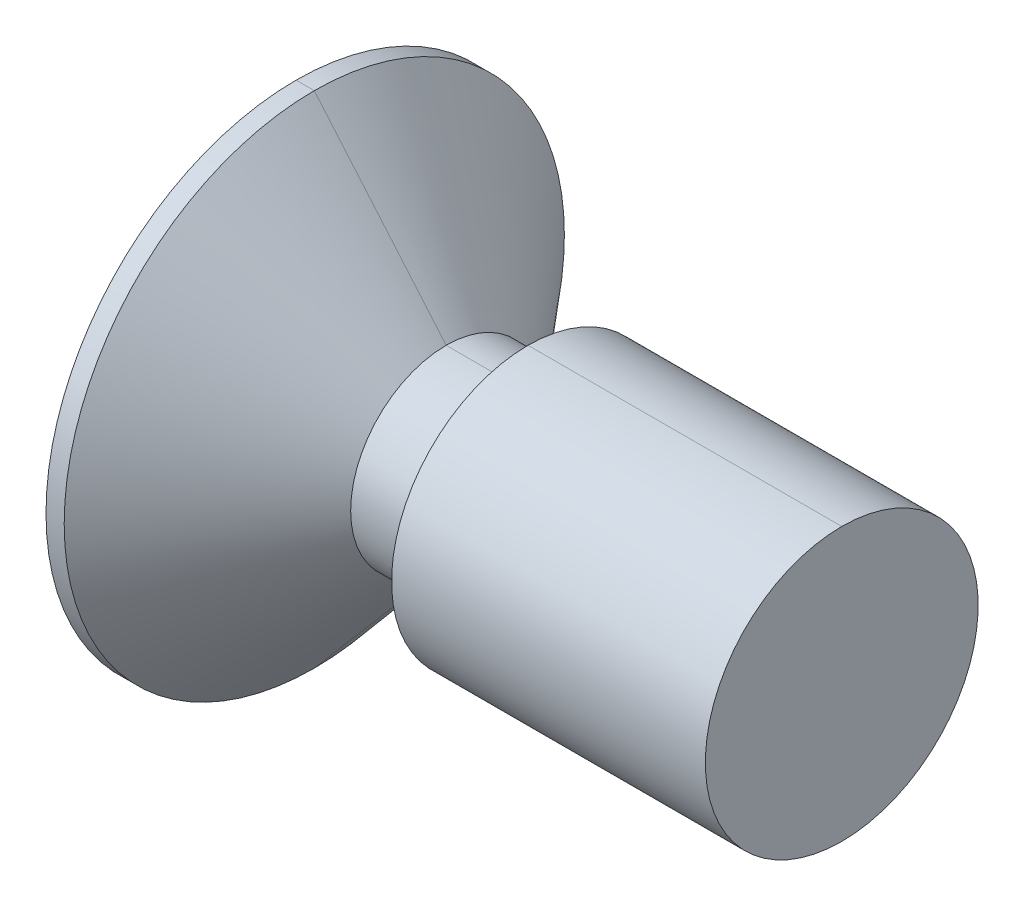
ISO-10303-21;
HEADER;
FILE_DESCRIPTION(('STEP AP214'),'2;1');
FILE_NAME('part.step','',(''),(''),'','','');
FILE_SCHEMA(('AUTOMOTIVE_DESIGN { 1 0 10303 214 1 1 1 1 }'));
ENDSEC;
DATA;
#1=APPLICATION_CONTEXT('core data for automotive mechanical design processes');
#2=APPLICATION_PROTOCOL_DEFINITION('international standard','automotive_design',2000,#1);
#3=PRODUCT_CONTEXT('',#1,'mechanical');
#4=PRODUCT('Part','Part','',(#3));
#5=PRODUCT_RELATED_PRODUCT_CATEGORY('part','',(#4));
#6=PRODUCT_DEFINITION_FORMATION('','',#4);
#7=PRODUCT_DEFINITION_CONTEXT('part definition',#1,'design');
#8=PRODUCT_DEFINITION('design','',#6,#7);
#9=PRODUCT_DEFINITION_SHAPE('','',#8);
#10=(LENGTH_UNIT() NAMED_UNIT(*) SI_UNIT(.MILLI.,.METRE.));
#11=(NAMED_UNIT(*) PLANE_ANGLE_UNIT() SI_UNIT($,.RADIAN.));
#12=(NAMED_UNIT(*) SI_UNIT($,.STERADIAN.) SOLID_ANGLE_UNIT());
#13=UNCERTAINTY_MEASURE_WITH_UNIT(LENGTH_MEASURE(1.E-05),#10,'distance_accuracy_value','');
#14=(GEOMETRIC_REPRESENTATION_CONTEXT(3) GLOBAL_UNCERTAINTY_ASSIGNED_CONTEXT((#13)) GLOBAL_UNIT_ASSIGNED_CONTEXT((#10,
#11,#12)) REPRESENTATION_CONTEXT('',''));
#15=CARTESIAN_POINT('',(0.,0.,0.));
#16=DIRECTION('',(0.,0.,1.));
#17=DIRECTION('',(1.,0.,0.));
#18=AXIS2_PLACEMENT_3D('',#15,#16,#17);
#19=CARTESIAN_POINT('',(-5.175,0.675,-0.675));
#20=DIRECTION('',(1.,0.,0.));
#21=DIRECTION('',(0.,1.,0.));
#22=AXIS2_PLACEMENT_3D('',#19,#20,#21);
#23=PLANE('',#22);
#24=DIRECTION('',(0.,-1.,0.));
#25=VECTOR('',#24,1.);
#26=CARTESIAN_POINT('',(-5.175,1.8,-0.375));
#27=LINE('',#26,#25);
#28=CARTESIAN_POINT('',(-5.175,1.8,-0.375));
#29=VERTEX_POINT('',#28);
#30=CARTESIAN_POINT('',(-5.175,0.675,-0.375));
#31=VERTEX_POINT('',#30);
#32=EDGE_CURVE('E346',#29,#31,#27,.T.);
#33=ORIENTED_EDGE('',*,*,#32,.T.);
#34=CARTESIAN_POINT('',(-5.175,0.675,-0.675));
#35=DIRECTION('',(1.,0.,0.));
#36=DIRECTION('',(0.,1.,0.));
#37=AXIS2_PLACEMENT_3D('',#34,#35,#36);
#38=CIRCLE('',#37,0.3);
#39=CARTESIAN_POINT('',(-5.175,0.375,-0.675));
#40=VERTEX_POINT('',#39);
#41=EDGE_CURVE('E10',#31,#40,#38,.T.);
#42=ORIENTED_EDGE('',*,*,#41,.T.);
#43=DIRECTION('',(0.,0.,-1.));
#44=VECTOR('',#43,1.);
#45=CARTESIAN_POINT('',(-5.175,0.375,-1.8));
#46=LINE('',#45,#44);
#47=CARTESIAN_POINT('',(-5.175,0.375,-1.8));
#48=VERTEX_POINT('',#47);
#49=EDGE_CURVE('E271',#40,#48,#46,.T.);
#50=ORIENTED_EDGE('',*,*,#49,.T.);
#51=DIRECTION('',(0.,-1.,0.));
#52=VECTOR('',#51,1.);
#53=CARTESIAN_POINT('',(-5.175,0.375,-1.8));
#54=LINE('',#53,#52);
#55=CARTESIAN_POINT('',(-5.175,-0.375,-1.8));
#56=VERTEX_POINT('',#55);
#57=EDGE_CURVE('E386',#48,#56,#54,.T.);
#58=ORIENTED_EDGE('',*,*,#57,.T.);
#59=DIRECTION('',(0.,0.,1.));
#60=VECTOR('',#59,1.);
#61=CARTESIAN_POINT('',(-5.175,-0.375,-1.8));
#62=LINE('',#61,#60);
#63=CARTESIAN_POINT('',(-5.175,-0.375,-0.675));
#64=VERTEX_POINT('',#63);
#65=EDGE_CURVE('E377',#56,#64,#62,.T.);
#66=ORIENTED_EDGE('',*,*,#65,.T.);
#67=CARTESIAN_POINT('',(-5.175,-0.675,-0.675));
#68=DIRECTION('',(1.,0.,0.));
#69=DIRECTION('',(0.,-1.,0.));
#70=AXIS2_PLACEMENT_3D('',#67,#68,#69);
#71=CIRCLE('',#70,0.3);
#72=CARTESIAN_POINT('',(-5.175,-0.675,-0.375));
#73=VERTEX_POINT('',#72);
#74=EDGE_CURVE('E281',#64,#73,#71,.T.);
#75=ORIENTED_EDGE('',*,*,#74,.T.);
#76=DIRECTION('',(0.,-1.,0.));
#77=VECTOR('',#76,1.);
#78=CARTESIAN_POINT('',(-5.175,-0.675,-0.375));
#79=LINE('',#78,#77);
#80=CARTESIAN_POINT('',(-5.175,-1.8,-0.375));
#81=VERTEX_POINT('',#80);
#82=EDGE_CURVE('E275',#73,#81,#79,.T.);
#83=ORIENTED_EDGE('',*,*,#82,.T.);
#84=DIRECTION('',(0.,0.,1.));
#85=VECTOR('',#84,1.);
#86=CARTESIAN_POINT('',(-5.175,-1.8,-0.375));
#87=LINE('',#86,#85);
#88=CARTESIAN_POINT('',(-5.175,-1.8,0.375));
#89=VERTEX_POINT('',#88);
#90=EDGE_CURVE('E268',#81,#89,#87,.T.);
#91=ORIENTED_EDGE('',*,*,#90,.T.);
#92=DIRECTION('',(0.,1.,0.));
#93=VECTOR('',#92,1.);
#94=CARTESIAN_POINT('',(-5.175,-0.675,0.375));
#95=LINE('',#94,#93);
#96=CARTESIAN_POINT('',(-5.175,-0.675,0.375));
#97=VERTEX_POINT('',#96);
#98=EDGE_CURVE('E223',#89,#97,#95,.T.);
#99=ORIENTED_EDGE('',*,*,#98,.T.);
#100=CARTESIAN_POINT('',(-5.175,-0.675,0.675));
#101=DIRECTION('',(1.,0.,0.));
#102=DIRECTION('',(0.,1.,0.));
#103=AXIS2_PLACEMENT_3D('',#100,#101,#102);
#104=CIRCLE('',#103,0.3);
#105=CARTESIAN_POINT('',(-5.175,-0.375,0.675));
#106=VERTEX_POINT('',#105);
#107=EDGE_CURVE('E221',#97,#106,#104,.T.);
#108=ORIENTED_EDGE('',*,*,#107,.T.);
#109=DIRECTION('',(0.,0.,1.));
#110=VECTOR('',#109,1.);
#111=CARTESIAN_POINT('',(-5.175,-0.375,0.675));
#112=LINE('',#111,#110);
#113=CARTESIAN_POINT('',(-5.175,-0.375,1.8));
#114=VERTEX_POINT('',#113);
#115=EDGE_CURVE('E276',#106,#114,#112,.T.);
#116=ORIENTED_EDGE('',*,*,#115,.T.);
#117=DIRECTION('',(0.,1.,0.));
#118=VECTOR('',#117,1.);
#119=CARTESIAN_POINT('',(-5.175,0.375,1.8));
#120=LINE('',#119,#118);
#121=CARTESIAN_POINT('',(-5.175,0.375,1.8));
#122=VERTEX_POINT('',#121);
#123=EDGE_CURVE('E264',#114,#122,#120,.T.);
#124=ORIENTED_EDGE('',*,*,#123,.T.);
#125=DIRECTION('',(0.,0.,-1.));
#126=VECTOR('',#125,1.);
#127=CARTESIAN_POINT('',(-5.175,0.375,0.675));
#128=LINE('',#127,#126);
#129=CARTESIAN_POINT('',(-5.175,0.375,0.675));
#130=VERTEX_POINT('',#129);
#131=EDGE_CURVE('E265',#122,#130,#128,.T.);
#132=ORIENTED_EDGE('',*,*,#131,.T.);
#133=CARTESIAN_POINT('',(-5.175,0.675,0.675));
#134=DIRECTION('',(1.,0.,0.));
#135=DIRECTION('',(0.,1.,0.));
#136=AXIS2_PLACEMENT_3D('',#133,#134,#135);
#137=CIRCLE('',#136,0.3);
#138=CARTESIAN_POINT('',(-5.175,0.675,0.375));
#139=VERTEX_POINT('',#138);
#140=EDGE_CURVE('E254',#130,#139,#137,.T.);
#141=ORIENTED_EDGE('',*,*,#140,.T.);
#142=DIRECTION('',(0.,1.,0.));
#143=VECTOR('',#142,1.);
#144=CARTESIAN_POINT('',(-5.175,1.8,0.375));
#145=LINE('',#144,#143);
#146=CARTESIAN_POINT('',(-5.175,1.8,0.375));
#147=VERTEX_POINT('',#146);
#148=EDGE_CURVE('E255',#139,#147,#145,.T.);
#149=ORIENTED_EDGE('',*,*,#148,.T.);
#150=DIRECTION('',(0.,0.,-1.));
#151=VECTOR('',#150,1.);
#152=CARTESIAN_POINT('',(-5.175,1.8,-0.375));
#153=LINE('',#152,#151);
#154=EDGE_CURVE('E345',#147,#29,#153,.T.);
#155=ORIENTED_EDGE('',*,*,#154,.T.);
#156=EDGE_LOOP('',(#33,#42,#50,#58,#66,#75,#83,#91,#99,#108,#116,#124,#132,#141,#149,#155));
#157=FACE_BOUND('',#156,.T.);
#158=ADVANCED_FACE('F16',(#157),#23,.F.);
#159=CARTESIAN_POINT('',(-5.175,0.675,-0.675));
#160=DIRECTION('',(-1.,0.,0.));
#161=DIRECTION('',(0.,-1.,0.));
#162=AXIS2_PLACEMENT_3D('',#159,#160,#161);
#163=CYLINDRICAL_SURFACE('',#162,0.3);
#164=CARTESIAN_POINT('',(-6.,0.675,-0.675));
#165=DIRECTION('',(1.,0.,0.));
#166=DIRECTION('',(0.,1.,0.));
#167=AXIS2_PLACEMENT_3D('',#164,#165,#166);
#168=CIRCLE('',#167,0.3);
#169=CARTESIAN_POINT('',(-6.,0.675,-0.375));
#170=VERTEX_POINT('',#169);
#171=CARTESIAN_POINT('',(-6.,0.375,-0.675));
#172=VERTEX_POINT('',#171);
#173=EDGE_CURVE('E340',#170,#172,#168,.T.);
#174=ORIENTED_EDGE('',*,*,#173,.T.);
#175=DIRECTION('',(-1.,0.,0.));
#176=VECTOR('',#175,1.);
#177=CARTESIAN_POINT('',(-5.175,0.375,-0.675));
#178=LINE('',#177,#176);
#179=EDGE_CURVE('E27',#40,#172,#178,.T.);
#180=ORIENTED_EDGE('',*,*,#179,.F.);
#181=ORIENTED_EDGE('',*,*,#41,.F.);
#182=DIRECTION('',(-1.,0.,0.));
#183=VECTOR('',#182,1.);
#184=CARTESIAN_POINT('',(-5.175,0.675,-0.375));
#185=LINE('',#184,#183);
#186=EDGE_CURVE('E353',#31,#170,#185,.T.);
#187=ORIENTED_EDGE('',*,*,#186,.T.);
#188=EDGE_LOOP('',(#174,#180,#181,#187));
#189=FACE_BOUND('',#188,.T.);
#190=ADVANCED_FACE('F736',(#189),#163,.T.);
#191=CARTESIAN_POINT('',(-5.175,0.375,-1.8));
#192=DIRECTION('',(0.,1.,0.));
#193=DIRECTION('',(1.,0.,0.));
#194=AXIS2_PLACEMENT_3D('',#191,#192,#193);
#195=PLANE('',#194);
#196=DIRECTION('',(0.,0.,-1.));
#197=VECTOR('',#196,1.);
#198=CARTESIAN_POINT('',(-6.,0.375,-1.8));
#199=LINE('',#198,#197);
#200=CARTESIAN_POINT('',(-6.,0.375,-1.8));
#201=VERTEX_POINT('',#200);
#202=EDGE_CURVE('E337',#172,#201,#199,.T.);
#203=ORIENTED_EDGE('',*,*,#202,.T.);
#204=DIRECTION('',(-1.,0.,0.));
#205=VECTOR('',#204,1.);
#206=CARTESIAN_POINT('',(-5.175,0.375,-1.8));
#207=LINE('',#206,#205);
#208=EDGE_CURVE('E306',#48,#201,#207,.T.);
#209=ORIENTED_EDGE('',*,*,#208,.F.);
#210=ORIENTED_EDGE('',*,*,#49,.F.);
#211=ORIENTED_EDGE('',*,*,#179,.T.);
#212=EDGE_LOOP('',(#203,#209,#210,#211));
#213=FACE_BOUND('',#212,.T.);
#214=ADVANCED_FACE('F507',(#213),#195,.F.);
#215=CARTESIAN_POINT('',(-5.175,0.375,-1.8));
#216=DIRECTION('',(0.,0.,-1.));
#217=DIRECTION('',(0.,-1.,0.));
#218=AXIS2_PLACEMENT_3D('',#215,#216,#217);
#219=PLANE('',#218);
#220=DIRECTION('',(0.,-1.,0.));
#221=VECTOR('',#220,1.);
#222=CARTESIAN_POINT('',(-6.,0.375,-1.8));
#223=LINE('',#222,#221);
#224=CARTESIAN_POINT('',(-6.,-0.375,-1.8));
#225=VERTEX_POINT('',#224);
#226=EDGE_CURVE('E341',#201,#225,#223,.T.);
#227=ORIENTED_EDGE('',*,*,#226,.T.);
#228=DIRECTION('',(-1.,0.,0.));
#229=VECTOR('',#228,1.);
#230=CARTESIAN_POINT('',(-5.175,-0.375,-1.8));
#231=LINE('',#230,#229);
#232=EDGE_CURVE('E379',#56,#225,#231,.T.);
#233=ORIENTED_EDGE('',*,*,#232,.F.);
#234=ORIENTED_EDGE('',*,*,#57,.F.);
#235=ORIENTED_EDGE('',*,*,#208,.T.);
#236=EDGE_LOOP('',(#227,#233,#234,#235));
#237=FACE_BOUND('',#236,.T.);
#238=ADVANCED_FACE('F976',(#237),#219,.F.);
#239=CARTESIAN_POINT('',(-5.175,-0.375,-1.8));
#240=DIRECTION('',(0.,-1.,0.));
#241=DIRECTION('',(0.,0.,-1.));
#242=AXIS2_PLACEMENT_3D('',#239,#240,#241);
#243=PLANE('',#242);
#244=DIRECTION('',(0.,0.,1.));
#245=VECTOR('',#244,1.);
#246=CARTESIAN_POINT('',(-6.,-0.375,-1.8));
#247=LINE('',#246,#245);
#248=CARTESIAN_POINT('',(-6.,-0.375,-0.675));
#249=VERTEX_POINT('',#248);
#250=EDGE_CURVE('E369',#225,#249,#247,.T.);
#251=ORIENTED_EDGE('',*,*,#250,.T.);
#252=DIRECTION('',(-1.,0.,0.));
#253=VECTOR('',#252,1.);
#254=CARTESIAN_POINT('',(-5.175,-0.375,-0.675));
#255=LINE('',#254,#253);
#256=EDGE_CURVE('E284',#64,#249,#255,.T.);
#257=ORIENTED_EDGE('',*,*,#256,.F.);
#258=ORIENTED_EDGE('',*,*,#65,.F.);
#259=ORIENTED_EDGE('',*,*,#232,.T.);
#260=EDGE_LOOP('',(#251,#257,#258,#259));
#261=FACE_BOUND('',#260,.T.);
#262=ADVANCED_FACE('F971',(#261),#243,.F.);
#263=CARTESIAN_POINT('',(-5.175,-0.675,-0.675));
#264=DIRECTION('',(-1.,0.,0.));
#265=DIRECTION('',(0.,-1.,0.));
#266=AXIS2_PLACEMENT_3D('',#263,#264,#265);
#267=CYLINDRICAL_SURFACE('',#266,0.3);
#268=CARTESIAN_POINT('',(-6.,-0.675,-0.675));
#269=DIRECTION('',(1.,0.,0.));
#270=DIRECTION('',(0.,-1.,0.));
#271=AXIS2_PLACEMENT_3D('',#268,#269,#270);
#272=CIRCLE('',#271,0.3);
#273=CARTESIAN_POINT('',(-6.,-0.675,-0.375));
#274=VERTEX_POINT('',#273);
#275=EDGE_CURVE('E372',#249,#274,#272,.T.);
#276=ORIENTED_EDGE('',*,*,#275,.T.);
#277=DIRECTION('',(-1.,0.,0.));
#278=VECTOR('',#277,1.);
#279=CARTESIAN_POINT('',(-5.175,-0.675,-0.375));
#280=LINE('',#279,#278);
#281=EDGE_CURVE('E285',#73,#274,#280,.T.);
#282=ORIENTED_EDGE('',*,*,#281,.F.);
#283=ORIENTED_EDGE('',*,*,#74,.F.);
#284=ORIENTED_EDGE('',*,*,#256,.T.);
#285=EDGE_LOOP('',(#276,#282,#283,#284));
#286=FACE_BOUND('',#285,.T.);
#287=ADVANCED_FACE('F975',(#286),#267,.T.);
#288=CARTESIAN_POINT('',(-5.175,-0.675,-0.375));
#289=DIRECTION('',(0.,0.,-1.));
#290=DIRECTION('',(0.,-1.,0.));
#291=AXIS2_PLACEMENT_3D('',#288,#289,#290);
#292=PLANE('',#291);
#293=DIRECTION('',(0.,-1.,0.));
#294=VECTOR('',#293,1.);
#295=CARTESIAN_POINT('',(-6.,-0.675,-0.375));
#296=LINE('',#295,#294);
#297=CARTESIAN_POINT('',(-6.,-1.8,-0.375));
#298=VERTEX_POINT('',#297);
#299=EDGE_CURVE('E375',#274,#298,#296,.T.);
#300=ORIENTED_EDGE('',*,*,#299,.T.);
#301=DIRECTION('',(-1.,0.,0.));
#302=VECTOR('',#301,1.);
#303=CARTESIAN_POINT('',(-5.175,-1.8,-0.375));
#304=LINE('',#303,#302);
#305=EDGE_CURVE('E272',#81,#298,#304,.T.);
#306=ORIENTED_EDGE('',*,*,#305,.F.);
#307=ORIENTED_EDGE('',*,*,#82,.F.);
#308=ORIENTED_EDGE('',*,*,#281,.T.);
#309=EDGE_LOOP('',(#300,#306,#307,#308));
#310=FACE_BOUND('',#309,.T.);
#311=ADVANCED_FACE('F702',(#310),#292,.F.);
#312=CARTESIAN_POINT('',(-5.175,-1.8,-0.375));
#313=DIRECTION('',(0.,-1.,0.));
#314=DIRECTION('',(0.,0.,-1.));
#315=AXIS2_PLACEMENT_3D('',#312,#313,#314);
#316=PLANE('',#315);
#317=DIRECTION('',(0.,0.,1.));
#318=VECTOR('',#317,1.);
#319=CARTESIAN_POINT('',(-6.,-1.8,-0.375));
#320=LINE('',#319,#318);
#321=CARTESIAN_POINT('',(-6.,-1.8,0.375));
#322=VERTEX_POINT('',#321);
#323=EDGE_CURVE('E231',#298,#322,#320,.T.);
#324=ORIENTED_EDGE('',*,*,#323,.T.);
#325=DIRECTION('',(-1.,0.,0.));
#326=VECTOR('',#325,1.);
#327=CARTESIAN_POINT('',(-5.175,-1.8,0.375));
#328=LINE('',#327,#326);
#329=EDGE_CURVE('E202',#89,#322,#328,.T.);
#330=ORIENTED_EDGE('',*,*,#329,.F.);
#331=ORIENTED_EDGE('',*,*,#90,.F.);
#332=ORIENTED_EDGE('',*,*,#305,.T.);
#333=EDGE_LOOP('',(#324,#330,#331,#332));
#334=FACE_BOUND('',#333,.T.);
#335=ADVANCED_FACE('F705',(#334),#316,.F.);
#336=CARTESIAN_POINT('',(-5.175,-0.675,0.375));
#337=DIRECTION('',(0.,0.,1.));
#338=DIRECTION('',(0.,-1.,0.));
#339=AXIS2_PLACEMENT_3D('',#336,#337,#338);
#340=PLANE('',#339);
#341=DIRECTION('',(0.,1.,0.));
#342=VECTOR('',#341,1.);
#343=CARTESIAN_POINT('',(-6.,-0.675,0.375));
#344=LINE('',#343,#342);
#345=CARTESIAN_POINT('',(-6.,-0.675,0.375));
#346=VERTEX_POINT('',#345);
#347=EDGE_CURVE('E226',#322,#346,#344,.T.);
#348=ORIENTED_EDGE('',*,*,#347,.T.);
#349=DIRECTION('',(-1.,0.,0.));
#350=VECTOR('',#349,1.);
#351=CARTESIAN_POINT('',(-5.175,-0.675,0.375));
#352=LINE('',#351,#350);
#353=EDGE_CURVE('E215',#97,#346,#352,.T.);
#354=ORIENTED_EDGE('',*,*,#353,.F.);
#355=ORIENTED_EDGE('',*,*,#98,.F.);
#356=ORIENTED_EDGE('',*,*,#329,.T.);
#357=EDGE_LOOP('',(#348,#354,#355,#356));
#358=FACE_BOUND('',#357,.T.);
#359=ADVANCED_FACE('F227',(#358),#340,.F.);
#360=CARTESIAN_POINT('',(-5.175,-0.675,0.675));
#361=DIRECTION('',(-1.,0.,0.));
#362=DIRECTION('',(0.,-1.,0.));
#363=AXIS2_PLACEMENT_3D('',#360,#361,#362);
#364=CYLINDRICAL_SURFACE('',#363,0.3);
#365=CARTESIAN_POINT('',(-6.,-0.675,0.675));
#366=DIRECTION('',(1.,0.,0.));
#367=DIRECTION('',(0.,1.,0.));
#368=AXIS2_PLACEMENT_3D('',#365,#366,#367);
#369=CIRCLE('',#368,0.3);
#370=CARTESIAN_POINT('',(-6.,-0.375,0.675));
#371=VERTEX_POINT('',#370);
#372=EDGE_CURVE('E219',#346,#371,#369,.T.);
#373=ORIENTED_EDGE('',*,*,#372,.T.);
#374=DIRECTION('',(-1.,0.,0.));
#375=VECTOR('',#374,1.);
#376=CARTESIAN_POINT('',(-5.175,-0.375,0.675));
#377=LINE('',#376,#375);
#378=EDGE_CURVE('E279',#106,#371,#377,.T.);
#379=ORIENTED_EDGE('',*,*,#378,.F.);
#380=ORIENTED_EDGE('',*,*,#107,.F.);
#381=ORIENTED_EDGE('',*,*,#353,.T.);
#382=EDGE_LOOP('',(#373,#379,#380,#381));
#383=FACE_BOUND('',#382,.T.);
#384=ADVANCED_FACE('F216',(#383),#364,.T.);
#385=CARTESIAN_POINT('',(-5.175,-0.375,0.675));
#386=DIRECTION('',(0.,-1.,0.));
#387=DIRECTION('',(0.,0.,-1.));
#388=AXIS2_PLACEMENT_3D('',#385,#386,#387);
#389=PLANE('',#388);
#390=DIRECTION('',(0.,0.,1.));
#391=VECTOR('',#390,1.);
#392=CARTESIAN_POINT('',(-6.,-0.375,0.675));
#393=LINE('',#392,#391);
#394=CARTESIAN_POINT('',(-6.,-0.375,1.8));
#395=VERTEX_POINT('',#394);
#396=EDGE_CURVE('E238',#371,#395,#393,.T.);
#397=ORIENTED_EDGE('',*,*,#396,.T.);
#398=DIRECTION('',(-1.,0.,0.));
#399=VECTOR('',#398,1.);
#400=CARTESIAN_POINT('',(-5.175,-0.375,1.8));
#401=LINE('',#400,#399);
#402=EDGE_CURVE('E280',#114,#395,#401,.T.);
#403=ORIENTED_EDGE('',*,*,#402,.F.);
#404=ORIENTED_EDGE('',*,*,#115,.F.);
#405=ORIENTED_EDGE('',*,*,#378,.T.);
#406=EDGE_LOOP('',(#397,#403,#404,#405));
#407=FACE_BOUND('',#406,.T.);
#408=ADVANCED_FACE('F709',(#407),#389,.F.);
#409=CARTESIAN_POINT('',(-5.175,0.375,1.8));
#410=DIRECTION('',(0.,0.,1.));
#411=DIRECTION('',(1.,0.,0.));
#412=AXIS2_PLACEMENT_3D('',#409,#410,#411);
#413=PLANE('',#412);
#414=DIRECTION('',(0.,1.,0.));
#415=VECTOR('',#414,1.);
#416=CARTESIAN_POINT('',(-6.,0.375,1.8));
#417=LINE('',#416,#415);
#418=CARTESIAN_POINT('',(-6.,0.375,1.8));
#419=VERTEX_POINT('',#418);
#420=EDGE_CURVE('E246',#395,#419,#417,.T.);
#421=ORIENTED_EDGE('',*,*,#420,.T.);
#422=DIRECTION('',(-1.,0.,0.));
#423=VECTOR('',#422,1.);
#424=CARTESIAN_POINT('',(-5.175,0.375,1.8));
#425=LINE('',#424,#423);
#426=EDGE_CURVE('E261',#122,#419,#425,.T.);
#427=ORIENTED_EDGE('',*,*,#426,.F.);
#428=ORIENTED_EDGE('',*,*,#123,.F.);
#429=ORIENTED_EDGE('',*,*,#402,.T.);
#430=EDGE_LOOP('',(#421,#427,#428,#429));
#431=FACE_BOUND('',#430,.T.);
#432=ADVANCED_FACE('F18',(#431),#413,.F.);
#433=CARTESIAN_POINT('',(-5.175,0.375,0.675));
#434=DIRECTION('',(0.,1.,0.));
#435=DIRECTION('',(0.,0.,-1.));
#436=AXIS2_PLACEMENT_3D('',#433,#434,#435);
#437=PLANE('',#436);
#438=DIRECTION('',(0.,0.,-1.));
#439=VECTOR('',#438,1.);
#440=CARTESIAN_POINT('',(-6.,0.375,0.675));
#441=LINE('',#440,#439);
#442=CARTESIAN_POINT('',(-6.,0.375,0.675));
#443=VERTEX_POINT('',#442);
#444=EDGE_CURVE('E291',#419,#443,#441,.T.);
#445=ORIENTED_EDGE('',*,*,#444,.T.);
#446=DIRECTION('',(-1.,0.,0.));
#447=VECTOR('',#446,1.);
#448=CARTESIAN_POINT('',(-5.175,0.375,0.675));
#449=LINE('',#448,#447);
#450=EDGE_CURVE('E290',#130,#443,#449,.T.);
#451=ORIENTED_EDGE('',*,*,#450,.F.);
#452=ORIENTED_EDGE('',*,*,#131,.F.);
#453=ORIENTED_EDGE('',*,*,#426,.T.);
#454=EDGE_LOOP('',(#445,#451,#452,#453));
#455=FACE_BOUND('',#454,.T.);
#456=ADVANCED_FACE('F717',(#455),#437,.F.);
#457=CARTESIAN_POINT('',(-5.175,0.675,0.675));
#458=DIRECTION('',(-1.,0.,0.));
#459=DIRECTION('',(0.,-1.,0.));
#460=AXIS2_PLACEMENT_3D('',#457,#458,#459);
#461=CYLINDRICAL_SURFACE('',#460,0.3);
#462=CARTESIAN_POINT('',(-6.,0.675,0.675));
#463=DIRECTION('',(1.,0.,0.));
#464=DIRECTION('',(0.,1.,0.));
#465=AXIS2_PLACEMENT_3D('',#462,#463,#464);
#466=CIRCLE('',#465,0.3);
#467=CARTESIAN_POINT('',(-6.,0.675,0.375));
#468=VERTEX_POINT('',#467);
#469=EDGE_CURVE('E295',#443,#468,#466,.T.);
#470=ORIENTED_EDGE('',*,*,#469,.T.);
#471=DIRECTION('',(-1.,0.,0.));
#472=VECTOR('',#471,1.);
#473=CARTESIAN_POINT('',(-5.175,0.675,0.375));
#474=LINE('',#473,#472);
#475=EDGE_CURVE('E252',#139,#468,#474,.T.);
#476=ORIENTED_EDGE('',*,*,#475,.F.);
#477=ORIENTED_EDGE('',*,*,#140,.F.);
#478=ORIENTED_EDGE('',*,*,#450,.T.);
#479=EDGE_LOOP('',(#470,#476,#477,#478));
#480=FACE_BOUND('',#479,.T.);
#481=ADVANCED_FACE('F720',(#480),#461,.T.);
#482=CARTESIAN_POINT('',(-5.175,1.8,0.375));
#483=DIRECTION('',(0.,0.,1.));
#484=DIRECTION('',(0.,-1.,0.));
#485=AXIS2_PLACEMENT_3D('',#482,#483,#484);
#486=PLANE('',#485);
#487=DIRECTION('',(0.,1.,0.));
#488=VECTOR('',#487,1.);
#489=CARTESIAN_POINT('',(-6.,1.8,0.375));
#490=LINE('',#489,#488);
#491=CARTESIAN_POINT('',(-6.,1.8,0.375));
#492=VERTEX_POINT('',#491);
#493=EDGE_CURVE('E20',#468,#492,#490,.T.);
#494=ORIENTED_EDGE('',*,*,#493,.T.);
#495=DIRECTION('',(-1.,0.,0.));
#496=VECTOR('',#495,1.);
#497=CARTESIAN_POINT('',(-5.175,1.8,0.375));
#498=LINE('',#497,#496);
#499=EDGE_CURVE('E435',#147,#492,#498,.T.);
#500=ORIENTED_EDGE('',*,*,#499,.F.);
#501=ORIENTED_EDGE('',*,*,#148,.F.);
#502=ORIENTED_EDGE('',*,*,#475,.T.);
#503=EDGE_LOOP('',(#494,#500,#501,#502));
#504=FACE_BOUND('',#503,.T.);
#505=ADVANCED_FACE('F499',(#504),#486,.F.);
#506=CARTESIAN_POINT('',(-5.175,1.8,-0.375));
#507=DIRECTION('',(0.,1.,0.));
#508=DIRECTION('',(0.,0.,-1.));
#509=AXIS2_PLACEMENT_3D('',#506,#507,#508);
#510=PLANE('',#509);
#511=DIRECTION('',(0.,0.,-1.));
#512=VECTOR('',#511,1.);
#513=CARTESIAN_POINT('',(-6.,1.8,-0.375));
#514=LINE('',#513,#512);
#515=CARTESIAN_POINT('',(-6.,1.8,-0.375));
#516=VERTEX_POINT('',#515);
#517=EDGE_CURVE('E428',#492,#516,#514,.T.);
#518=ORIENTED_EDGE('',*,*,#517,.T.);
#519=DIRECTION('',(-1.,0.,0.));
#520=VECTOR('',#519,1.);
#521=CARTESIAN_POINT('',(-5.175,1.8,-0.375));
#522=LINE('',#521,#520);
#523=EDGE_CURVE('E342',#29,#516,#522,.T.);
#524=ORIENTED_EDGE('',*,*,#523,.F.);
#525=ORIENTED_EDGE('',*,*,#154,.F.);
#526=ORIENTED_EDGE('',*,*,#499,.T.);
#527=EDGE_LOOP('',(#518,#524,#525,#526));
#528=FACE_BOUND('',#527,.T.);
#529=ADVANCED_FACE('F722',(#528),#510,.F.);
#530=CARTESIAN_POINT('',(-5.175,1.8,-0.375));
#531=DIRECTION('',(0.,0.,-1.));
#532=DIRECTION('',(0.,-1.,0.));
#533=AXIS2_PLACEMENT_3D('',#530,#531,#532);
#534=PLANE('',#533);
#535=DIRECTION('',(0.,-1.,0.));
#536=VECTOR('',#535,1.);
#537=CARTESIAN_POINT('',(-6.,1.8,-0.375));
#538=LINE('',#537,#536);
#539=EDGE_CURVE('E469',#516,#170,#538,.T.);
#540=ORIENTED_EDGE('',*,*,#539,.T.);
#541=ORIENTED_EDGE('',*,*,#186,.F.);
#542=ORIENTED_EDGE('',*,*,#32,.F.);
#543=ORIENTED_EDGE('',*,*,#523,.T.);
#544=EDGE_LOOP('',(#540,#541,#542,#543));
#545=FACE_BOUND('',#544,.T.);
#546=ADVANCED_FACE('F723',(#545),#534,.F.);
#547=CARTESIAN_POINT('',(-6.,2.75,0.));
#548=DIRECTION('',(-1.,0.,0.));
#549=DIRECTION('',(0.,1.,0.));
#550=AXIS2_PLACEMENT_3D('',#547,#548,#549);
#551=PLANE('',#550);
#552=ORIENTED_EDGE('',*,*,#539,.F.);
#553=ORIENTED_EDGE('',*,*,#517,.F.);
#554=ORIENTED_EDGE('',*,*,#493,.F.);
#555=ORIENTED_EDGE('',*,*,#469,.F.);
#556=ORIENTED_EDGE('',*,*,#444,.F.);
#557=ORIENTED_EDGE('',*,*,#420,.F.);
#558=ORIENTED_EDGE('',*,*,#396,.F.);
#559=ORIENTED_EDGE('',*,*,#372,.F.);
#560=ORIENTED_EDGE('',*,*,#347,.F.);
#561=ORIENTED_EDGE('',*,*,#323,.F.);
#562=ORIENTED_EDGE('',*,*,#299,.F.);
#563=ORIENTED_EDGE('',*,*,#275,.F.);
#564=ORIENTED_EDGE('',*,*,#250,.F.);
#565=ORIENTED_EDGE('',*,*,#226,.F.);
#566=ORIENTED_EDGE('',*,*,#202,.F.);
#567=ORIENTED_EDGE('',*,*,#173,.F.);
#568=EDGE_LOOP('',(#552,#553,#554,#555,#556,#557,#558,#559,#560,#561,#562,#563,#564,#565,#566,#567));
#569=FACE_BOUND('',#568,.T.);
#570=CARTESIAN_POINT('',(-6.,0.,0.));
#571=DIRECTION('',(1.,0.,0.));
#572=DIRECTION('',(0.,1.,0.));
#573=AXIS2_PLACEMENT_3D('',#570,#571,#572);
#574=CIRCLE('',#573,2.75);
#575=CARTESIAN_POINT('',(-6.,2.75,0.));
#576=VERTEX_POINT('',#575);
#577=CARTESIAN_POINT('',(-6.,-2.75,0.));
#578=VERTEX_POINT('',#577);
#579=EDGE_CURVE('E250',#576,#578,#574,.T.);
#580=ORIENTED_EDGE('',*,*,#579,.F.);
#581=CARTESIAN_POINT('',(-6.,0.,0.));
#582=DIRECTION('',(1.,0.,0.));
#583=DIRECTION('',(0.,1.,0.));
#584=AXIS2_PLACEMENT_3D('',#581,#582,#583);
#585=CIRCLE('',#584,2.75);
#586=EDGE_CURVE('E460',#578,#576,#585,.T.);
#587=ORIENTED_EDGE('',*,*,#586,.F.);
#588=EDGE_LOOP('',(#580,#587));
#589=FACE_BOUND('',#588,.T.);
#590=ADVANCED_FACE('F234',(#569,#589),#551,.T.);
#591=CARTESIAN_POINT('',(0.,0.,0.));
#592=DIRECTION('',(1.,0.,0.));
#593=DIRECTION('',(0.,1.,0.));
#594=AXIS2_PLACEMENT_3D('',#591,#592,#593);
#595=CYLINDRICAL_SURFACE('',#594,2.75);
#596=DIRECTION('',(1.,0.,0.));
#597=VECTOR('',#596,1.);
#598=CARTESIAN_POINT('',(0.,-2.75,0.));
#599=LINE('',#598,#597);
#600=CARTESIAN_POINT('',(-5.8,-2.75,0.));
#601=VERTEX_POINT('',#600);
#602=EDGE_CURVE('E430',#578,#601,#599,.T.);
#603=ORIENTED_EDGE('',*,*,#602,.F.);
#604=ORIENTED_EDGE('',*,*,#586,.T.);
#605=DIRECTION('',(1.,0.,0.));
#606=VECTOR('',#605,1.);
#607=CARTESIAN_POINT('',(0.,2.75,0.));
#608=LINE('',#607,#606);
#609=CARTESIAN_POINT('',(-5.8,2.75,0.));
#610=VERTEX_POINT('',#609);
#611=EDGE_CURVE('E404',#576,#610,#608,.T.);
#612=ORIENTED_EDGE('',*,*,#611,.T.);
#613=CARTESIAN_POINT('',(-5.8,0.,0.));
#614=DIRECTION('',(1.,0.,0.));
#615=DIRECTION('',(0.,1.,0.));
#616=AXIS2_PLACEMENT_3D('',#613,#614,#615);
#617=CIRCLE('',#616,2.75);
#618=EDGE_CURVE('E458',#601,#610,#617,.T.);
#619=ORIENTED_EDGE('',*,*,#618,.F.);
#620=EDGE_LOOP('',(#603,#604,#612,#619));
#621=FACE_BOUND('',#620,.T.);
#622=ADVANCED_FACE('F730',(#621),#595,.T.);
#623=CARTESIAN_POINT('',(-4.35,0.,0.));
#624=DIRECTION('',(-1.,0.,0.));
#625=DIRECTION('',(0.,-1.,0.));
#626=AXIS2_PLACEMENT_3D('',#623,#624,#625);
#627=CONICAL_SURFACE('',#626,1.05,0.8645972343669);
#628=DIRECTION('',(-0.648946606082749,0.760833951959086,0.));
#629=VECTOR('',#628,1.);
#630=CARTESIAN_POINT('',(-4.35,1.05,0.));
#631=LINE('',#630,#629);
#632=CARTESIAN_POINT('',(-4.35,1.05,0.));
#633=VERTEX_POINT('',#632);
#634=EDGE_CURVE('E332',#633,#610,#631,.T.);
#635=ORIENTED_EDGE('',*,*,#634,.F.);
#636=CARTESIAN_POINT('',(-4.35,0.,0.));
#637=DIRECTION('',(1.,0.,0.));
#638=DIRECTION('',(0.,1.,0.));
#639=AXIS2_PLACEMENT_3D('',#636,#637,#638);
#640=CIRCLE('',#639,1.05);
#641=CARTESIAN_POINT('',(-4.35,-1.05,0.));
#642=VERTEX_POINT('',#641);
#643=EDGE_CURVE('E461',#642,#633,#640,.T.);
#644=ORIENTED_EDGE('',*,*,#643,.F.);
#645=DIRECTION('',(-0.648946606082749,-0.760833951959086,0.));
#646=VECTOR('',#645,1.);
#647=CARTESIAN_POINT('',(-4.35,-1.05,0.));
#648=LINE('',#647,#646);
#649=EDGE_CURVE('E321',#642,#601,#648,.T.);
#650=ORIENTED_EDGE('',*,*,#649,.T.);
#651=ORIENTED_EDGE('',*,*,#618,.T.);
#652=EDGE_LOOP('',(#635,#644,#650,#651));
#653=FACE_BOUND('',#652,.T.);
#654=ADVANCED_FACE('F759',(#653),#627,.T.);
#655=CARTESIAN_POINT('',(0.,0.,0.));
#656=DIRECTION('',(1.,0.,0.));
#657=DIRECTION('',(0.,1.,0.));
#658=AXIS2_PLACEMENT_3D('',#655,#656,#657);
#659=CYLINDRICAL_SURFACE('',#658,1.05);
#660=DIRECTION('',(1.,0.,0.));
#661=VECTOR('',#660,1.);
#662=CARTESIAN_POINT('',(0.,-1.05,0.));
#663=LINE('',#662,#661);
#664=CARTESIAN_POINT('',(-3.45,-1.05,0.));
#665=VERTEX_POINT('',#664);
#666=EDGE_CURVE('E310',#642,#665,#663,.T.);
#667=ORIENTED_EDGE('',*,*,#666,.F.);
#668=ORIENTED_EDGE('',*,*,#643,.T.);
#669=DIRECTION('',(1.,0.,0.));
#670=VECTOR('',#669,1.);
#671=CARTESIAN_POINT('',(0.,1.05,0.));
#672=LINE('',#671,#670);
#673=CARTESIAN_POINT('',(-3.45,1.05,0.));
#674=VERTEX_POINT('',#673);
#675=EDGE_CURVE('E304',#633,#674,#672,.T.);
#676=ORIENTED_EDGE('',*,*,#675,.T.);
#677=CARTESIAN_POINT('',(-3.45,0.,0.));
#678=DIRECTION('',(1.,0.,0.));
#679=DIRECTION('',(0.,1.,0.));
#680=AXIS2_PLACEMENT_3D('',#677,#678,#679);
#681=CIRCLE('',#680,1.05);
#682=EDGE_CURVE('E259',#665,#674,#681,.T.);
#683=ORIENTED_EDGE('',*,*,#682,.F.);
#684=EDGE_LOOP('',(#667,#668,#676,#683));
#685=FACE_BOUND('',#684,.T.);
#686=ADVANCED_FACE('F765',(#685),#659,.T.);
#687=CARTESIAN_POINT('',(-3.45,1.5,0.));
#688=DIRECTION('',(-1.,0.,0.));
#689=DIRECTION('',(0.,1.,0.));
#690=AXIS2_PLACEMENT_3D('',#687,#688,#689);
#691=PLANE('',#690);
#692=CARTESIAN_POINT('',(-3.45,0.,0.));
#693=DIRECTION('',(1.,0.,0.));
#694=DIRECTION('',(0.,1.,0.));
#695=AXIS2_PLACEMENT_3D('',#692,#693,#694);
#696=CIRCLE('',#695,1.05);
#697=EDGE_CURVE('E307',#674,#665,#696,.T.);
#698=ORIENTED_EDGE('',*,*,#697,.T.);
#699=ORIENTED_EDGE('',*,*,#682,.T.);
#700=EDGE_LOOP('',(#698,#699));
#701=FACE_BOUND('',#700,.T.);
#702=CARTESIAN_POINT('',(-3.45,0.,0.));
#703=DIRECTION('',(1.,0.,0.));
#704=DIRECTION('',(0.,1.,0.));
#705=AXIS2_PLACEMENT_3D('',#702,#703,#704);
#706=CIRCLE('',#705,1.5);
#707=CARTESIAN_POINT('',(-3.45,1.5,0.));
#708=VERTEX_POINT('',#707);
#709=CARTESIAN_POINT('',(-3.45,-1.5,0.));
#710=VERTEX_POINT('',#709);
#711=EDGE_CURVE('E299',#708,#710,#706,.T.);
#712=ORIENTED_EDGE('',*,*,#711,.F.);
#713=CARTESIAN_POINT('',(-3.45,0.,0.));
#714=DIRECTION('',(1.,0.,0.));
#715=DIRECTION('',(0.,1.,0.));
#716=AXIS2_PLACEMENT_3D('',#713,#714,#715);
#717=CIRCLE('',#716,1.5);
#718=EDGE_CURVE('E256',#710,#708,#717,.T.);
#719=ORIENTED_EDGE('',*,*,#718,.F.);
#720=EDGE_LOOP('',(#712,#719));
#721=FACE_BOUND('',#720,.T.);
#722=ADVANCED_FACE('F761',(#701,#721),#691,.T.);
#723=CARTESIAN_POINT('',(0.,0.,0.));
#724=DIRECTION('',(1.,0.,0.));
#725=DIRECTION('',(0.,1.,0.));
#726=AXIS2_PLACEMENT_3D('',#723,#724,#725);
#727=CYLINDRICAL_SURFACE('',#726,1.5);
#728=DIRECTION('',(1.,0.,0.));
#729=VECTOR('',#728,1.);
#730=CARTESIAN_POINT('',(0.,-1.5,0.));
#731=LINE('',#730,#729);
#732=CARTESIAN_POINT('',(0.,-1.5,0.));
#733=VERTEX_POINT('',#732);
#734=EDGE_CURVE('E303',#710,#733,#731,.T.);
#735=ORIENTED_EDGE('',*,*,#734,.F.);
#736=ORIENTED_EDGE('',*,*,#718,.T.);
#737=DIRECTION('',(1.,0.,0.));
#738=VECTOR('',#737,1.);
#739=CARTESIAN_POINT('',(0.,1.5,0.));
#740=LINE('',#739,#738);
#741=CARTESIAN_POINT('',(0.,1.5,0.));
#742=VERTEX_POINT('',#741);
#743=EDGE_CURVE('E350',#708,#742,#740,.T.);
#744=ORIENTED_EDGE('',*,*,#743,.T.);
#745=CARTESIAN_POINT('',(0.,0.,0.));
#746=DIRECTION('',(1.,0.,0.));
#747=DIRECTION('',(0.,1.,0.));
#748=AXIS2_PLACEMENT_3D('',#745,#746,#747);
#749=CIRCLE('',#748,1.5);
#750=EDGE_CURVE('E260',#733,#742,#749,.T.);
#751=ORIENTED_EDGE('',*,*,#750,.F.);
#752=EDGE_LOOP('',(#735,#736,#744,#751));
#753=FACE_BOUND('',#752,.T.);
#754=ADVANCED_FACE('F764',(#753),#727,.T.);
#755=CARTESIAN_POINT('',(0.,0.,0.));
#756=DIRECTION('',(1.,0.,0.));
#757=DIRECTION('',(0.,1.,0.));
#758=AXIS2_PLACEMENT_3D('',#755,#756,#757);
#759=PLANE('',#758);
#760=CARTESIAN_POINT('',(0.,0.,0.));
#761=DIRECTION('',(1.,0.,0.));
#762=DIRECTION('',(0.,1.,0.));
#763=AXIS2_PLACEMENT_3D('',#760,#761,#762);
#764=CIRCLE('',#763,1.5);
#765=EDGE_CURVE('E347',#742,#733,#764,.T.);
#766=ORIENTED_EDGE('',*,*,#765,.T.);
#767=ORIENTED_EDGE('',*,*,#750,.T.);
#768=EDGE_LOOP('',(#766,#767));
#769=FACE_BOUND('',#768,.T.);
#770=ADVANCED_FACE('F742',(#769),#759,.T.);
#771=CARTESIAN_POINT('',(0.,0.,0.));
#772=DIRECTION('',(1.,0.,0.));
#773=DIRECTION('',(0.,1.,0.));
#774=AXIS2_PLACEMENT_3D('',#771,#772,#773);
#775=CYLINDRICAL_SURFACE('',#774,1.5);
#776=ORIENTED_EDGE('',*,*,#711,.T.);
#777=ORIENTED_EDGE('',*,*,#734,.T.);
#778=ORIENTED_EDGE('',*,*,#765,.F.);
#779=ORIENTED_EDGE('',*,*,#743,.F.);
#780=EDGE_LOOP('',(#776,#777,#778,#779));
#781=FACE_BOUND('',#780,.T.);
#782=ADVANCED_FACE('F772',(#781),#775,.T.);
#783=CARTESIAN_POINT('',(0.,0.,0.));
#784=DIRECTION('',(1.,0.,0.));
#785=DIRECTION('',(0.,1.,0.));
#786=AXIS2_PLACEMENT_3D('',#783,#784,#785);
#787=CYLINDRICAL_SURFACE('',#786,1.05);
#788=CARTESIAN_POINT('',(-4.35,0.,0.));
#789=DIRECTION('',(1.,0.,0.));
#790=DIRECTION('',(0.,1.,0.));
#791=AXIS2_PLACEMENT_3D('',#788,#789,#790);
#792=CIRCLE('',#791,1.05);
#793=EDGE_CURVE('E401',#633,#642,#792,.T.);
#794=ORIENTED_EDGE('',*,*,#793,.T.);
#795=ORIENTED_EDGE('',*,*,#666,.T.);
#796=ORIENTED_EDGE('',*,*,#697,.F.);
#797=ORIENTED_EDGE('',*,*,#675,.F.);
#798=EDGE_LOOP('',(#794,#795,#796,#797));
#799=FACE_BOUND('',#798,.T.);
#800=ADVANCED_FACE('F769',(#799),#787,.T.);
#801=CARTESIAN_POINT('',(-4.35,0.,0.));
#802=DIRECTION('',(-1.,0.,0.));
#803=DIRECTION('',(0.,-1.,0.));
#804=AXIS2_PLACEMENT_3D('',#801,#802,#803);
#805=CONICAL_SURFACE('',#804,1.05,0.8645972343669);
#806=ORIENTED_EDGE('',*,*,#793,.F.);
#807=ORIENTED_EDGE('',*,*,#634,.T.);
#808=CARTESIAN_POINT('',(-5.8,0.,0.));
#809=DIRECTION('',(1.,0.,0.));
#810=DIRECTION('',(0.,1.,0.));
#811=AXIS2_PLACEMENT_3D('',#808,#809,#810);
#812=CIRCLE('',#811,2.75);
#813=EDGE_CURVE('E408',#610,#601,#812,.T.);
#814=ORIENTED_EDGE('',*,*,#813,.T.);
#815=ORIENTED_EDGE('',*,*,#649,.F.);
#816=EDGE_LOOP('',(#806,#807,#814,#815));
#817=FACE_BOUND('',#816,.T.);
#818=ADVANCED_FACE('F771',(#817),#805,.T.);
#819=CARTESIAN_POINT('',(0.,0.,0.));
#820=DIRECTION('',(1.,0.,0.));
#821=DIRECTION('',(0.,1.,0.));
#822=AXIS2_PLACEMENT_3D('',#819,#820,#821);
#823=CYLINDRICAL_SURFACE('',#822,2.75);
#824=ORIENTED_EDGE('',*,*,#579,.T.);
#825=ORIENTED_EDGE('',*,*,#602,.T.);
#826=ORIENTED_EDGE('',*,*,#813,.F.);
#827=ORIENTED_EDGE('',*,*,#611,.F.);
#828=EDGE_LOOP('',(#824,#825,#826,#827));
#829=FACE_BOUND('',#828,.T.);
#830=ADVANCED_FACE('F774',(#829),#823,.T.);
#831=CLOSED_SHELL('',(#158,#190,#214,#238,#262,#287,#311,#335,#359,#384,#408,#432,#456,#481,
#505,#529,#546,#590,#622,#654,#686,#722,#754,#770,#782,#800,#818,#830));
#832=MANIFOLD_SOLID_BREP('B1',#831);
#833=ADVANCED_BREP_SHAPE_REPRESENTATION('',(#18,#832),#14);
#834=SHAPE_DEFINITION_REPRESENTATION(#9,#833);
ENDSEC;
END-ISO-10303-21;
